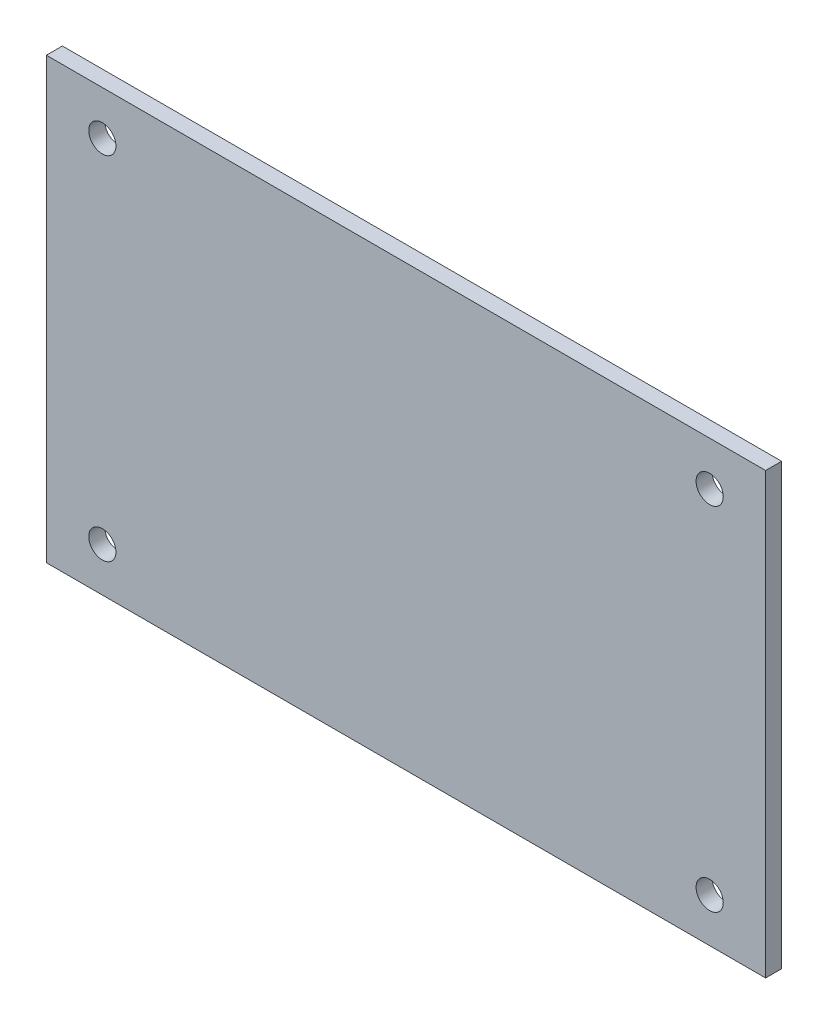
ISO-10303-21;
HEADER;
FILE_DESCRIPTION(('STEP AP214'),'2;1');
FILE_NAME('part.step','',(''),(''),'','','');
FILE_SCHEMA(('AUTOMOTIVE_DESIGN { 1 0 10303 214 1 1 1 1 }'));
ENDSEC;
DATA;
#1=APPLICATION_CONTEXT('core data for automotive mechanical design processes');
#2=APPLICATION_PROTOCOL_DEFINITION('international standard','automotive_design',2000,#1);
#3=PRODUCT_CONTEXT('',#1,'mechanical');
#4=PRODUCT('Part','Part','',(#3));
#5=PRODUCT_RELATED_PRODUCT_CATEGORY('part','',(#4));
#6=PRODUCT_DEFINITION_FORMATION('','',#4);
#7=PRODUCT_DEFINITION_CONTEXT('part definition',#1,'design');
#8=PRODUCT_DEFINITION('design','',#6,#7);
#9=PRODUCT_DEFINITION_SHAPE('','',#8);
#10=(LENGTH_UNIT() NAMED_UNIT(*) SI_UNIT(.MILLI.,.METRE.));
#11=(NAMED_UNIT(*) PLANE_ANGLE_UNIT() SI_UNIT($,.RADIAN.));
#12=(NAMED_UNIT(*) SI_UNIT($,.STERADIAN.) SOLID_ANGLE_UNIT());
#13=UNCERTAINTY_MEASURE_WITH_UNIT(LENGTH_MEASURE(1.E-05),#10,'distance_accuracy_value','');
#14=(GEOMETRIC_REPRESENTATION_CONTEXT(3) GLOBAL_UNCERTAINTY_ASSIGNED_CONTEXT((#13)) GLOBAL_UNIT_ASSIGNED_CONTEXT((#10,
#11,#12)) REPRESENTATION_CONTEXT('',''));
#15=CARTESIAN_POINT('',(0.,0.,0.));
#16=DIRECTION('',(0.,0.,1.));
#17=DIRECTION('',(1.,0.,0.));
#18=AXIS2_PLACEMENT_3D('',#15,#16,#17);
#19=CARTESIAN_POINT('',(0.,0.,2.));
#20=DIRECTION('',(0.,0.,1.));
#21=DIRECTION('',(1.,0.,0.));
#22=AXIS2_PLACEMENT_3D('',#19,#20,#21);
#23=PLANE('',#22);
#24=CARTESIAN_POINT('',(38.,22.,2.));
#25=DIRECTION('',(0.,0.,1.));
#26=DIRECTION('',(1.,0.,0.));
#27=AXIS2_PLACEMENT_3D('',#24,#25,#26);
#28=CIRCLE('',#27,1.7);
#29=CARTESIAN_POINT('',(39.7,22.,2.));
#30=VERTEX_POINT('',#29);
#31=EDGE_CURVE('E102',#30,#30,#28,.T.);
#32=ORIENTED_EDGE('',*,*,#31,.F.);
#33=EDGE_LOOP('',(#32));
#34=FACE_BOUND('',#33,.T.);
#35=CARTESIAN_POINT('',(38.,-22.,2.));
#36=DIRECTION('',(0.,0.,1.));
#37=DIRECTION('',(1.,0.,0.));
#38=AXIS2_PLACEMENT_3D('',#35,#36,#37);
#39=CIRCLE('',#38,1.7);
#40=CARTESIAN_POINT('',(39.7,-22.,2.));
#41=VERTEX_POINT('',#40);
#42=EDGE_CURVE('E99',#41,#41,#39,.T.);
#43=ORIENTED_EDGE('',*,*,#42,.F.);
#44=EDGE_LOOP('',(#43));
#45=FACE_BOUND('',#44,.T.);
#46=CARTESIAN_POINT('',(-38.,22.,2.));
#47=DIRECTION('',(0.,0.,1.));
#48=DIRECTION('',(1.,0.,0.));
#49=AXIS2_PLACEMENT_3D('',#46,#47,#48);
#50=CIRCLE('',#49,1.7);
#51=CARTESIAN_POINT('',(-36.3,22.,2.));
#52=VERTEX_POINT('',#51);
#53=EDGE_CURVE('E96',#52,#52,#50,.T.);
#54=ORIENTED_EDGE('',*,*,#53,.F.);
#55=EDGE_LOOP('',(#54));
#56=FACE_BOUND('',#55,.T.);
#57=CARTESIAN_POINT('',(-38.,-22.,2.));
#58=DIRECTION('',(0.,0.,1.));
#59=DIRECTION('',(1.,0.,0.));
#60=AXIS2_PLACEMENT_3D('',#57,#58,#59);
#61=CIRCLE('',#60,1.7);
#62=CARTESIAN_POINT('',(-36.3,-22.,2.));
#63=VERTEX_POINT('',#62);
#64=EDGE_CURVE('E73',#63,#63,#61,.T.);
#65=ORIENTED_EDGE('',*,*,#64,.F.);
#66=EDGE_LOOP('',(#65));
#67=FACE_BOUND('',#66,.T.);
#68=DIRECTION('',(-1.,0.,0.));
#69=VECTOR('',#68,1.);
#70=CARTESIAN_POINT('',(0.,-27.5,2.));
#71=LINE('',#70,#69);
#72=CARTESIAN_POINT('',(45.,-27.5,2.));
#73=VERTEX_POINT('',#72);
#74=CARTESIAN_POINT('',(-45.,-27.5,2.));
#75=VERTEX_POINT('',#74);
#76=EDGE_CURVE('E10',#73,#75,#71,.T.);
#77=ORIENTED_EDGE('',*,*,#76,.F.);
#78=DIRECTION('',(0.,-1.,0.));
#79=VECTOR('',#78,1.);
#80=CARTESIAN_POINT('',(45.,0.,2.));
#81=LINE('',#80,#79);
#82=CARTESIAN_POINT('',(45.,27.5,2.));
#83=VERTEX_POINT('',#82);
#84=EDGE_CURVE('E62',#83,#73,#81,.T.);
#85=ORIENTED_EDGE('',*,*,#84,.F.);
#86=DIRECTION('',(1.,0.,0.));
#87=VECTOR('',#86,1.);
#88=CARTESIAN_POINT('',(0.,27.5,2.));
#89=LINE('',#88,#87);
#90=CARTESIAN_POINT('',(-45.,27.5,2.));
#91=VERTEX_POINT('',#90);
#92=EDGE_CURVE('E90',#91,#83,#89,.T.);
#93=ORIENTED_EDGE('',*,*,#92,.F.);
#94=DIRECTION('',(0.,1.,0.));
#95=VECTOR('',#94,1.);
#96=CARTESIAN_POINT('',(-45.,0.,2.));
#97=LINE('',#96,#95);
#98=EDGE_CURVE('E24',#75,#91,#97,.T.);
#99=ORIENTED_EDGE('',*,*,#98,.F.);
#100=EDGE_LOOP('',(#77,#85,#93,#99));
#101=FACE_BOUND('',#100,.T.);
#102=ADVANCED_FACE('F16',(#34,#45,#56,#67,#101),#23,.T.);
#103=CARTESIAN_POINT('',(0.,-27.5,0.));
#104=DIRECTION('',(0.,-1.,0.));
#105=DIRECTION('',(0.,0.,-1.));
#106=AXIS2_PLACEMENT_3D('',#103,#104,#105);
#107=PLANE('',#106);
#108=DIRECTION('',(0.,0.,1.));
#109=VECTOR('',#108,1.);
#110=CARTESIAN_POINT('',(45.,-27.5,0.));
#111=LINE('',#110,#109);
#112=CARTESIAN_POINT('',(45.,-27.5,0.));
#113=VERTEX_POINT('',#112);
#114=EDGE_CURVE('E55',#113,#73,#111,.T.);
#115=ORIENTED_EDGE('',*,*,#114,.T.);
#116=ORIENTED_EDGE('',*,*,#76,.T.);
#117=DIRECTION('',(0.,0.,1.));
#118=VECTOR('',#117,1.);
#119=CARTESIAN_POINT('',(-45.,-27.5,0.));
#120=LINE('',#119,#118);
#121=CARTESIAN_POINT('',(-45.,-27.5,0.));
#122=VERTEX_POINT('',#121);
#123=EDGE_CURVE('E68',#122,#75,#120,.T.);
#124=ORIENTED_EDGE('',*,*,#123,.F.);
#125=DIRECTION('',(1.,0.,0.));
#126=VECTOR('',#125,1.);
#127=CARTESIAN_POINT('',(0.,-27.5,0.));
#128=LINE('',#127,#126);
#129=EDGE_CURVE('E66',#122,#113,#128,.T.);
#130=ORIENTED_EDGE('',*,*,#129,.T.);
#131=EDGE_LOOP('',(#115,#116,#124,#130));
#132=FACE_BOUND('',#131,.T.);
#133=ADVANCED_FACE('F67',(#132),#107,.T.);
#134=CARTESIAN_POINT('',(-45.,0.,0.));
#135=DIRECTION('',(-1.,0.,0.));
#136=DIRECTION('',(0.,0.,1.));
#137=AXIS2_PLACEMENT_3D('',#134,#135,#136);
#138=PLANE('',#137);
#139=ORIENTED_EDGE('',*,*,#123,.T.);
#140=ORIENTED_EDGE('',*,*,#98,.T.);
#141=DIRECTION('',(0.,0.,1.));
#142=VECTOR('',#141,1.);
#143=CARTESIAN_POINT('',(-45.,27.5,0.));
#144=LINE('',#143,#142);
#145=CARTESIAN_POINT('',(-45.,27.5,0.));
#146=VERTEX_POINT('',#145);
#147=EDGE_CURVE('E85',#146,#91,#144,.T.);
#148=ORIENTED_EDGE('',*,*,#147,.F.);
#149=DIRECTION('',(0.,-1.,0.));
#150=VECTOR('',#149,1.);
#151=CARTESIAN_POINT('',(-45.,0.,0.));
#152=LINE('',#151,#150);
#153=EDGE_CURVE('E72',#146,#122,#152,.T.);
#154=ORIENTED_EDGE('',*,*,#153,.T.);
#155=EDGE_LOOP('',(#139,#140,#148,#154));
#156=FACE_BOUND('',#155,.T.);
#157=ADVANCED_FACE('F123',(#156),#138,.T.);
#158=CARTESIAN_POINT('',(0.,27.5,0.));
#159=DIRECTION('',(0.,1.,0.));
#160=DIRECTION('',(0.,0.,1.));
#161=AXIS2_PLACEMENT_3D('',#158,#159,#160);
#162=PLANE('',#161);
#163=ORIENTED_EDGE('',*,*,#147,.T.);
#164=ORIENTED_EDGE('',*,*,#92,.T.);
#165=DIRECTION('',(0.,0.,1.));
#166=VECTOR('',#165,1.);
#167=CARTESIAN_POINT('',(45.,27.5,0.));
#168=LINE('',#167,#166);
#169=CARTESIAN_POINT('',(45.,27.5,0.));
#170=VERTEX_POINT('',#169);
#171=EDGE_CURVE('E63',#170,#83,#168,.T.);
#172=ORIENTED_EDGE('',*,*,#171,.F.);
#173=DIRECTION('',(-1.,0.,0.));
#174=VECTOR('',#173,1.);
#175=CARTESIAN_POINT('',(0.,27.5,0.));
#176=LINE('',#175,#174);
#177=EDGE_CURVE('E78',#170,#146,#176,.T.);
#178=ORIENTED_EDGE('',*,*,#177,.T.);
#179=EDGE_LOOP('',(#163,#164,#172,#178));
#180=FACE_BOUND('',#179,.T.);
#181=ADVANCED_FACE('F125',(#180),#162,.T.);
#182=CARTESIAN_POINT('',(0.,0.,0.));
#183=DIRECTION('',(0.,0.,-1.));
#184=DIRECTION('',(-1.,0.,0.));
#185=AXIS2_PLACEMENT_3D('',#182,#183,#184);
#186=PLANE('',#185);
#187=CARTESIAN_POINT('',(38.,22.,0.));
#188=DIRECTION('',(0.,0.,-1.));
#189=DIRECTION('',(-1.,0.,0.));
#190=AXIS2_PLACEMENT_3D('',#187,#188,#189);
#191=CIRCLE('',#190,1.7);
#192=CARTESIAN_POINT('',(36.3,22.,0.));
#193=VERTEX_POINT('',#192);
#194=EDGE_CURVE('E19',#193,#193,#191,.T.);
#195=ORIENTED_EDGE('',*,*,#194,.F.);
#196=EDGE_LOOP('',(#195));
#197=FACE_BOUND('',#196,.T.);
#198=CARTESIAN_POINT('',(38.,-22.,0.));
#199=DIRECTION('',(0.,0.,-1.));
#200=DIRECTION('',(-1.,0.,0.));
#201=AXIS2_PLACEMENT_3D('',#198,#199,#200);
#202=CIRCLE('',#201,1.7);
#203=CARTESIAN_POINT('',(36.3,-22.,0.));
#204=VERTEX_POINT('',#203);
#205=EDGE_CURVE('E100',#204,#204,#202,.T.);
#206=ORIENTED_EDGE('',*,*,#205,.F.);
#207=EDGE_LOOP('',(#206));
#208=FACE_BOUND('',#207,.T.);
#209=CARTESIAN_POINT('',(-38.,22.,0.));
#210=DIRECTION('',(0.,0.,-1.));
#211=DIRECTION('',(-1.,0.,0.));
#212=AXIS2_PLACEMENT_3D('',#209,#210,#211);
#213=CIRCLE('',#212,1.7);
#214=CARTESIAN_POINT('',(-39.7,22.,0.));
#215=VERTEX_POINT('',#214);
#216=EDGE_CURVE('E97',#215,#215,#213,.T.);
#217=ORIENTED_EDGE('',*,*,#216,.F.);
#218=EDGE_LOOP('',(#217));
#219=FACE_BOUND('',#218,.T.);
#220=CARTESIAN_POINT('',(-38.,-22.,0.));
#221=DIRECTION('',(0.,0.,-1.));
#222=DIRECTION('',(-1.,0.,0.));
#223=AXIS2_PLACEMENT_3D('',#220,#221,#222);
#224=CIRCLE('',#223,1.7);
#225=CARTESIAN_POINT('',(-39.7,-22.,0.));
#226=VERTEX_POINT('',#225);
#227=EDGE_CURVE('E93',#226,#226,#224,.T.);
#228=ORIENTED_EDGE('',*,*,#227,.F.);
#229=EDGE_LOOP('',(#228));
#230=FACE_BOUND('',#229,.T.);
#231=DIRECTION('',(0.,1.,0.));
#232=VECTOR('',#231,1.);
#233=CARTESIAN_POINT('',(45.,0.,0.));
#234=LINE('',#233,#232);
#235=EDGE_CURVE('E60',#113,#170,#234,.T.);
#236=ORIENTED_EDGE('',*,*,#235,.F.);
#237=ORIENTED_EDGE('',*,*,#129,.F.);
#238=ORIENTED_EDGE('',*,*,#153,.F.);
#239=ORIENTED_EDGE('',*,*,#177,.F.);
#240=EDGE_LOOP('',(#236,#237,#238,#239));
#241=FACE_BOUND('',#240,.T.);
#242=ADVANCED_FACE('F76',(#197,#208,#219,#230,#241),#186,.T.);
#243=CARTESIAN_POINT('',(45.,0.,0.));
#244=DIRECTION('',(1.,0.,0.));
#245=DIRECTION('',(0.,0.,-1.));
#246=AXIS2_PLACEMENT_3D('',#243,#244,#245);
#247=PLANE('',#246);
#248=ORIENTED_EDGE('',*,*,#235,.T.);
#249=ORIENTED_EDGE('',*,*,#171,.T.);
#250=ORIENTED_EDGE('',*,*,#84,.T.);
#251=ORIENTED_EDGE('',*,*,#114,.F.);
#252=EDGE_LOOP('',(#248,#249,#250,#251));
#253=FACE_BOUND('',#252,.T.);
#254=ADVANCED_FACE('F57',(#253),#247,.T.);
#255=CARTESIAN_POINT('',(-38.,-22.,-0.3));
#256=DIRECTION('',(0.,0.,1.));
#257=DIRECTION('',(1.,0.,0.));
#258=AXIS2_PLACEMENT_3D('',#255,#256,#257);
#259=CYLINDRICAL_SURFACE('',#258,1.7);
#260=ORIENTED_EDGE('',*,*,#64,.T.);
#261=EDGE_LOOP('',(#260));
#262=FACE_BOUND('',#261,.T.);
#263=ORIENTED_EDGE('',*,*,#227,.T.);
#264=EDGE_LOOP('',(#263));
#265=FACE_BOUND('',#264,.T.);
#266=ADVANCED_FACE('F117',(#262,#265),#259,.F.);
#267=CARTESIAN_POINT('',(-38.,22.,-0.3));
#268=DIRECTION('',(0.,0.,1.));
#269=DIRECTION('',(1.,0.,0.));
#270=AXIS2_PLACEMENT_3D('',#267,#268,#269);
#271=CYLINDRICAL_SURFACE('',#270,1.7);
#272=ORIENTED_EDGE('',*,*,#53,.T.);
#273=EDGE_LOOP('',(#272));
#274=FACE_BOUND('',#273,.T.);
#275=ORIENTED_EDGE('',*,*,#216,.T.);
#276=EDGE_LOOP('',(#275));
#277=FACE_BOUND('',#276,.T.);
#278=ADVANCED_FACE('F180',(#274,#277),#271,.F.);
#279=CARTESIAN_POINT('',(38.,-22.,-0.3));
#280=DIRECTION('',(0.,0.,1.));
#281=DIRECTION('',(1.,0.,0.));
#282=AXIS2_PLACEMENT_3D('',#279,#280,#281);
#283=CYLINDRICAL_SURFACE('',#282,1.7);
#284=ORIENTED_EDGE('',*,*,#42,.T.);
#285=EDGE_LOOP('',(#284));
#286=FACE_BOUND('',#285,.T.);
#287=ORIENTED_EDGE('',*,*,#205,.T.);
#288=EDGE_LOOP('',(#287));
#289=FACE_BOUND('',#288,.T.);
#290=ADVANCED_FACE('F189',(#286,#289),#283,.F.);
#291=CARTESIAN_POINT('',(38.,22.,-0.3));
#292=DIRECTION('',(0.,0.,1.));
#293=DIRECTION('',(1.,0.,0.));
#294=AXIS2_PLACEMENT_3D('',#291,#292,#293);
#295=CYLINDRICAL_SURFACE('',#294,1.7);
#296=ORIENTED_EDGE('',*,*,#31,.T.);
#297=EDGE_LOOP('',(#296));
#298=FACE_BOUND('',#297,.T.);
#299=ORIENTED_EDGE('',*,*,#194,.T.);
#300=EDGE_LOOP('',(#299));
#301=FACE_BOUND('',#300,.T.);
#302=ADVANCED_FACE('F199',(#298,#301),#295,.F.);
#303=CLOSED_SHELL('',(#102,#133,#157,#181,#242,#254,#266,#278,#290,#302));
#304=MANIFOLD_SOLID_BREP('B1',#303);
#305=ADVANCED_BREP_SHAPE_REPRESENTATION('',(#18,#304),#14);
#306=SHAPE_DEFINITION_REPRESENTATION(#9,#305);
ENDSEC;
END-ISO-10303-21;
